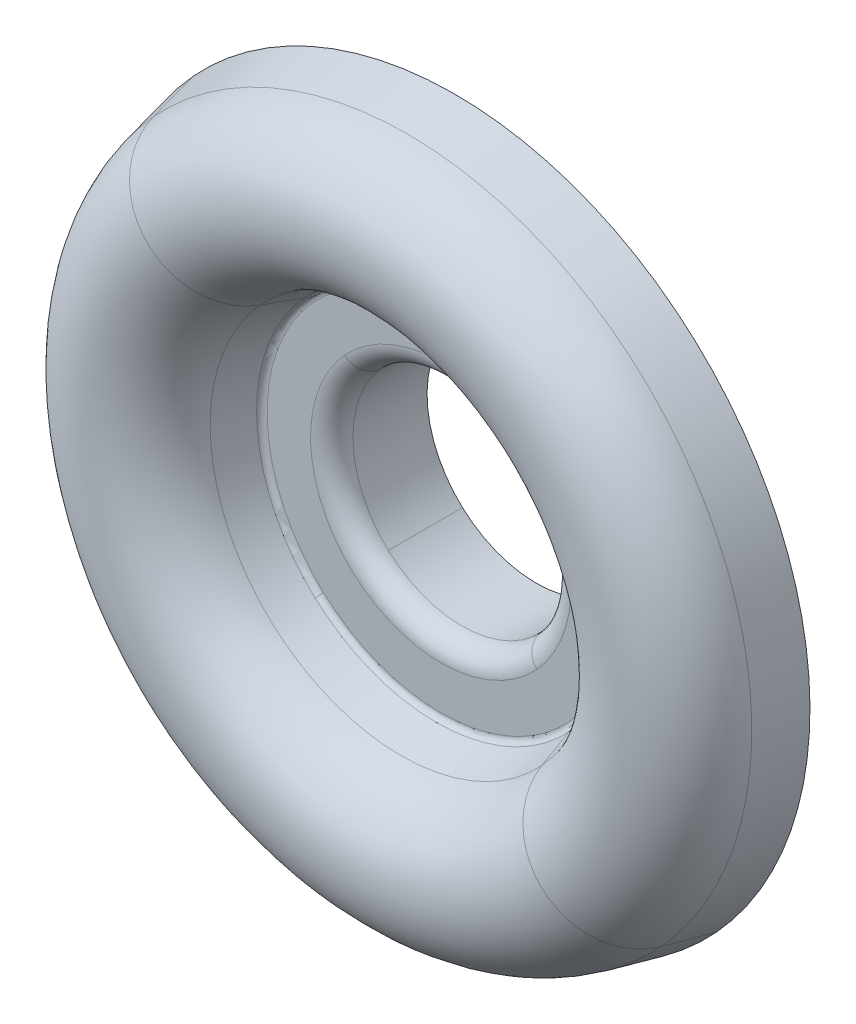
ISO-10303-21;
HEADER;
FILE_DESCRIPTION(('STEP AP214'),'2;1');
FILE_NAME('part.step','',(''),(''),'','','');
FILE_SCHEMA(('AUTOMOTIVE_DESIGN { 1 0 10303 214 1 1 1 1 }'));
ENDSEC;
DATA;
#1=APPLICATION_CONTEXT('core data for automotive mechanical design processes');
#2=APPLICATION_PROTOCOL_DEFINITION('international standard','automotive_design',2000,#1);
#3=PRODUCT_CONTEXT('',#1,'mechanical');
#4=PRODUCT('Part','Part','',(#3));
#5=PRODUCT_RELATED_PRODUCT_CATEGORY('part','',(#4));
#6=PRODUCT_DEFINITION_FORMATION('','',#4);
#7=PRODUCT_DEFINITION_CONTEXT('part definition',#1,'design');
#8=PRODUCT_DEFINITION('design','',#6,#7);
#9=PRODUCT_DEFINITION_SHAPE('','',#8);
#10=(LENGTH_UNIT() NAMED_UNIT(*) SI_UNIT(.MILLI.,.METRE.));
#11=(NAMED_UNIT(*) PLANE_ANGLE_UNIT() SI_UNIT($,.RADIAN.));
#12=(NAMED_UNIT(*) SI_UNIT($,.STERADIAN.) SOLID_ANGLE_UNIT());
#13=UNCERTAINTY_MEASURE_WITH_UNIT(LENGTH_MEASURE(1.E-05),#10,'distance_accuracy_value','');
#14=(GEOMETRIC_REPRESENTATION_CONTEXT(3) GLOBAL_UNCERTAINTY_ASSIGNED_CONTEXT((#13)) GLOBAL_UNIT_ASSIGNED_CONTEXT((#10,
#11,#12)) REPRESENTATION_CONTEXT('',''));
#15=CARTESIAN_POINT('',(0.,0.,0.));
#16=DIRECTION('',(0.,0.,1.));
#17=DIRECTION('',(1.,0.,0.));
#18=AXIS2_PLACEMENT_3D('',#15,#16,#17);
#19=CARTESIAN_POINT('',(5.15751240197929,0.152610441769653,10.4919115262798));
#20=DIRECTION('',(0.,0.,1.));
#21=DIRECTION('',(-0.675341182864473,-0.737505448608493,0.));
#22=AXIS2_PLACEMENT_3D('',#19,#20,#21);
#23=CYLINDRICAL_SURFACE('',#22,5.15);
#24=DIRECTION('',(0.,0.,1.));
#25=VECTOR('',#24,1.);
#26=CARTESIAN_POINT('',(8.63551949373132,3.95076350210339,10.4919115262798));
#27=LINE('',#26,#25);
#28=CARTESIAN_POINT('',(8.63551949373132,3.95076350210339,1.49521803507002));
#29=VERTEX_POINT('',#28);
#30=CARTESIAN_POINT('',(8.63551949373132,3.95076350210339,4.99521803507002));
#31=VERTEX_POINT('',#30);
#32=EDGE_CURVE('E296',#29,#31,#27,.T.);
#33=ORIENTED_EDGE('',*,*,#32,.F.);
#34=CARTESIAN_POINT('',(5.15751240197929,0.152610441769653,1.49521803507002));
#35=DIRECTION('',(0.,0.,-1.));
#36=DIRECTION('',(-0.675341182864473,-0.737505448608493,0.));
#37=AXIS2_PLACEMENT_3D('',#34,#35,#36);
#38=CIRCLE('',#37,5.15);
#39=CARTESIAN_POINT('',(1.67950531022725,-3.64554261856409,1.49521803507002));
#40=VERTEX_POINT('',#39);
#41=EDGE_CURVE('E11',#29,#40,#38,.T.);
#42=ORIENTED_EDGE('',*,*,#41,.T.);
#43=DIRECTION('',(0.,0.,1.));
#44=VECTOR('',#43,1.);
#45=CARTESIAN_POINT('',(1.67950531022725,-3.64554261856409,10.4919115262798));
#46=LINE('',#45,#44);
#47=CARTESIAN_POINT('',(1.67950531022725,-3.64554261856409,4.99521803507002));
#48=VERTEX_POINT('',#47);
#49=EDGE_CURVE('E166',#40,#48,#46,.T.);
#50=ORIENTED_EDGE('',*,*,#49,.T.);
#51=CARTESIAN_POINT('',(5.15751240197929,0.152610441769653,4.99521803507002));
#52=DIRECTION('',(0.,0.,-1.));
#53=DIRECTION('',(0.737505448608493,-0.675341182864473,0.));
#54=AXIS2_PLACEMENT_3D('',#51,#52,#53);
#55=CIRCLE('',#54,5.15);
#56=CARTESIAN_POINT('',(8.95566546231302,-3.32539664998238,4.99521803507002));
#57=VERTEX_POINT('',#56);
#58=EDGE_CURVE('E280',#57,#48,#55,.T.);
#59=ORIENTED_EDGE('',*,*,#58,.F.);
#60=CARTESIAN_POINT('',(5.15751240197929,0.152610441769653,4.99521803507002));
#61=DIRECTION('',(0.,0.,-1.));
#62=DIRECTION('',(0.737505448608493,-0.675341182864473,0.));
#63=AXIS2_PLACEMENT_3D('',#60,#61,#62);
#64=CIRCLE('',#63,5.15);
#65=EDGE_CURVE('E25',#31,#57,#64,.T.);
#66=ORIENTED_EDGE('',*,*,#65,.F.);
#67=EDGE_LOOP('',(#33,#42,#50,#59,#66));
#68=FACE_BOUND('',#67,.T.);
#69=ADVANCED_FACE('F17',(#68),#23,.F.);
#70=CARTESIAN_POINT('',(8.95566546231303,-3.32539664998238,1.49521803507002));
#71=DIRECTION('',(0.,0.,1.));
#72=DIRECTION('',(0.,-1.,0.));
#73=AXIS2_PLACEMENT_3D('',#70,#71,#72);
#74=PLANE('',#73);
#75=CARTESIAN_POINT('',(5.15751240197929,0.152610441769653,1.49521803507002));
#76=DIRECTION('',(0.,0.,-1.));
#77=DIRECTION('',(-0.675341182864473,-0.737505448608493,0.));
#78=AXIS2_PLACEMENT_3D('',#75,#76,#77);
#79=CIRCLE('',#78,5.15);
#80=EDGE_CURVE('E292',#40,#29,#79,.T.);
#81=ORIENTED_EDGE('',*,*,#80,.F.);
#82=ORIENTED_EDGE('',*,*,#41,.F.);
#83=EDGE_LOOP('',(#81,#82));
#84=FACE_BOUND('',#83,.T.);
#85=CARTESIAN_POINT('',(5.15751240197929,0.152610441769653,1.49521803499492));
#86=DIRECTION('',(0.,0.,1.));
#87=DIRECTION('',(-0.675341182864473,-0.737505448608493,0.));
#88=AXIS2_PLACEMENT_3D('',#85,#86,#87);
#89=CIRCLE('',#88,6.10000000006039);
#90=CARTESIAN_POINT('',(1.03793118646522,-4.3461727947867,1.49521803499492));
#91=VERTEX_POINT('',#90);
#92=CARTESIAN_POINT('',(9.27709361749335,4.651393678326,1.49521803499492));
#93=VERTEX_POINT('',#92);
#94=EDGE_CURVE('E212',#91,#93,#89,.T.);
#95=ORIENTED_EDGE('',*,*,#94,.F.);
#96=CARTESIAN_POINT('',(5.15751240197929,0.152610441769653,1.49521803499492));
#97=DIRECTION('',(0.,0.,1.));
#98=DIRECTION('',(-0.675341182864473,-0.737505448608493,0.));
#99=AXIS2_PLACEMENT_3D('',#96,#97,#98);
#100=CIRCLE('',#99,6.10000000006039);
#101=EDGE_CURVE('E323',#93,#91,#100,.T.);
#102=ORIENTED_EDGE('',*,*,#101,.F.);
#103=EDGE_LOOP('',(#95,#102));
#104=FACE_BOUND('',#103,.T.);
#105=ADVANCED_FACE('F342',(#84,#104),#74,.F.);
#106=CARTESIAN_POINT('',(5.15751240197929,0.152610441769653,4.99521803507001));
#107=DIRECTION('',(0.,0.,1.));
#108=DIRECTION('',(-0.737505448608493,0.675341182864473,0.));
#109=AXIS2_PLACEMENT_3D('',#106,#107,#108);
#110=TOROIDAL_SURFACE('',#109,6.15,1.);
#111=CARTESIAN_POINT('',(9.69317091092152,-4.00073783284685,4.99521803507002));
#112=DIRECTION('',(-0.675341182864473,-0.737505448608493,0.));
#113=DIRECTION('',(0.737505448608493,-0.675341182864473,0.));
#114=AXIS2_PLACEMENT_3D('',#111,#112,#113);
#115=CIRCLE('',#114,1.);
#116=CARTESIAN_POINT('',(9.69317091092152,-4.00073783284685,5.99521803507002));
#117=VERTEX_POINT('',#116);
#118=EDGE_CURVE('E276',#117,#57,#115,.T.);
#119=ORIENTED_EDGE('',*,*,#118,.F.);
#120=CARTESIAN_POINT('',(5.15751240197929,0.152610441769654,5.99521803507002));
#121=DIRECTION('',(0.,0.,1.));
#122=DIRECTION('',(-0.737505448608493,0.675341182864473,0.));
#123=AXIS2_PLACEMENT_3D('',#120,#121,#122);
#124=CIRCLE('',#123,6.15);
#125=CARTESIAN_POINT('',(0.621853893037051,4.30595871638616,5.99521803507001));
#126=VERTEX_POINT('',#125);
#127=EDGE_CURVE('E320',#117,#126,#124,.T.);
#128=ORIENTED_EDGE('',*,*,#127,.T.);
#129=CARTESIAN_POINT('',(0.621853893037052,4.30595871638616,4.99521803507001));
#130=DIRECTION('',(0.675341182864472,0.737505448608493,0.));
#131=DIRECTION('',(-0.737505448608493,0.675341182864473,0.));
#132=AXIS2_PLACEMENT_3D('',#129,#130,#131);
#133=CIRCLE('',#132,1.);
#134=CARTESIAN_POINT('',(1.35935934164554,3.63061753352169,4.99521803507002));
#135=VERTEX_POINT('',#134);
#136=EDGE_CURVE('E288',#126,#135,#133,.T.);
#137=ORIENTED_EDGE('',*,*,#136,.T.);
#138=CARTESIAN_POINT('',(5.15751240197929,0.152610441769653,4.99521803507002));
#139=DIRECTION('',(0.,0.,-1.));
#140=DIRECTION('',(0.737505448608493,-0.675341182864473,0.));
#141=AXIS2_PLACEMENT_3D('',#138,#139,#140);
#142=CIRCLE('',#141,5.15);
#143=EDGE_CURVE('E300',#135,#31,#142,.T.);
#144=ORIENTED_EDGE('',*,*,#143,.T.);
#145=ORIENTED_EDGE('',*,*,#65,.T.);
#146=EDGE_LOOP('',(#119,#128,#137,#144,#145));
#147=FACE_BOUND('',#146,.T.);
#148=ADVANCED_FACE('F330',(#147),#110,.T.);
#149=CARTESIAN_POINT('',(5.15751240197929,0.152610441769653,4.9954828752401));
#150=DIRECTION('',(0.,0.,1.));
#151=DIRECTION('',(-0.675341182864473,-0.737505448608493,0.));
#152=AXIS2_PLACEMENT_3D('',#149,#150,#151);
#153=CONICAL_SURFACE('',#152,11.2565941322487,0.974444845103528);
#154=DIRECTION('',(0.558770693541171,0.610204799389614,0.561627469806632));
#155=VECTOR('',#154,1.);
#156=CARTESIAN_POINT('',(12.7595539982774,8.45440994707744,4.9954828752401));
#157=LINE('',#156,#155);
#158=CARTESIAN_POINT('',(12.7595539982774,8.45440994707744,4.9954828752401));
#159=VERTEX_POINT('',#158);
#160=EDGE_CURVE('E215',#93,#159,#157,.T.);
#161=ORIENTED_EDGE('',*,*,#160,.F.);
#162=ORIENTED_EDGE('',*,*,#101,.T.);
#163=DIRECTION('',(-0.558770693541171,-0.610204799389614,0.561627469806632));
#164=VECTOR('',#163,1.);
#165=CARTESIAN_POINT('',(-2.44452919431881,-8.14918906353813,4.9954828752401));
#166=LINE('',#165,#164);
#167=CARTESIAN_POINT('',(-2.44452919431881,-8.14918906353813,4.9954828752401));
#168=VERTEX_POINT('',#167);
#169=EDGE_CURVE('E268',#91,#168,#166,.T.);
#170=ORIENTED_EDGE('',*,*,#169,.T.);
#171=CARTESIAN_POINT('',(5.15751240197929,0.152610441769653,4.9954828752401));
#172=DIRECTION('',(0.,0.,-1.));
#173=DIRECTION('',(-0.675341182864473,-0.737505448608493,0.));
#174=AXIS2_PLACEMENT_3D('',#171,#172,#173);
#175=CIRCLE('',#174,11.2565941322487);
#176=EDGE_CURVE('E314',#168,#159,#175,.T.);
#177=ORIENTED_EDGE('',*,*,#176,.T.);
#178=EDGE_LOOP('',(#161,#162,#170,#177));
#179=FACE_BOUND('',#178,.T.);
#180=ADVANCED_FACE('F353',(#179),#153,.T.);
#181=CARTESIAN_POINT('',(11.2050570805689,-5.38518725771902,5.99521803507002));
#182=DIRECTION('',(0.,0.,-1.));
#183=DIRECTION('',(-1.,0.,0.));
#184=AXIS2_PLACEMENT_3D('',#181,#182,#183);
#185=PLANE('',#184);
#186=CARTESIAN_POINT('',(5.15751240197929,0.152610441769654,5.99521803507002));
#187=DIRECTION('',(0.,0.,1.));
#188=DIRECTION('',(-0.737505448608493,0.675341182864473,0.));
#189=AXIS2_PLACEMENT_3D('',#186,#187,#188);
#190=CIRCLE('',#189,6.15);
#191=EDGE_CURVE('E272',#126,#117,#190,.T.);
#192=ORIENTED_EDGE('',*,*,#191,.F.);
#193=ORIENTED_EDGE('',*,*,#127,.F.);
#194=EDGE_LOOP('',(#192,#193));
#195=FACE_BOUND('',#194,.T.);
#196=CARTESIAN_POINT('',(-0.380285297509393,-5.89493423682,5.99521803507002));
#197=CARTESIAN_POINT('',(-0.0922213743543307,-6.15871727865539,5.99521803507002));
#198=CARTESIAN_POINT('',(0.363179620260049,-6.52013975612108,5.99521803507002));
#199=CARTESIAN_POINT('',(0.93526472293661,-6.88185816391147,5.99521803507002));
#200=CARTESIAN_POINT('',(1.23150325984817,-7.04773208049343,5.99521803507002));
#201=CARTESIAN_POINT('',(1.38217152469727,-7.1269227169561,5.99521803507002));
#202=CARTESIAN_POINT('',(1.45814290622015,-7.16558145473036,5.99521803507002));
#203=CARTESIAN_POINT('',(1.49628790925618,-7.18467667850323,5.99521803507002));
#204=CARTESIAN_POINT('',(1.51266990604474,-7.19281017188139,5.99521803507002));
#205=CARTESIAN_POINT('',(1.52359882353591,-7.19822135103283,5.99521803507001));
#206=CARTESIAN_POINT('',(1.52801183913365,-7.20040176644097,5.99521803507002));
#207=CARTESIAN_POINT('',(1.74341212340666,-7.30646505648578,5.99521803507002));
#208=CARTESIAN_POINT('',(2.06197003369478,-7.44690754042669,5.99521803507002));
#209=CARTESIAN_POINT('',(2.44280563934014,-7.5865521681706,5.99521803507001));
#210=CARTESIAN_POINT('',(2.63551961974013,-7.6503232478291,5.99521803507002));
#211=CARTESIAN_POINT('',(2.73245065433446,-7.68069597910498,5.99521803507002));
#212=CARTESIAN_POINT('',(2.77411553581653,-7.69338869067607,5.99521803507002));
#213=CARTESIAN_POINT('',(2.80191945891858,-7.70177845988759,5.99521803507002));
#214=CARTESIAN_POINT('',(2.81415347557782,-7.70543959516857,5.99521803507002));
#215=CARTESIAN_POINT('',(3.0795389390133,-7.78398939017279,5.99521803507002));
#216=CARTESIAN_POINT('',(3.45762443742333,-7.87669177297467,5.99521803507002));
#217=CARTESIAN_POINT('',(3.90471560400414,-7.95300952339128,5.99521803507002));
#218=CARTESIAN_POINT('',(4.12975904190349,-7.98320964121984,5.99521803507002));
#219=CARTESIAN_POINT('',(4.24265522450539,-7.99632001078921,5.99521803507002));
#220=CARTESIAN_POINT('',(4.29111954497455,-8.00151237860216,5.99521803507002));
#221=CARTESIAN_POINT('',(4.32344692355648,-8.00487921003246,5.99521803507002));
#222=CARTESIAN_POINT('',(4.33789392939384,-8.00634583638863,5.99521803507002));
#223=CARTESIAN_POINT('',(4.6423149719147,-8.03623327130151,5.99521803507002));
#224=CARTESIAN_POINT('',(5.07179903779497,-8.05583862249786,5.99521803507002));
#225=CARTESIAN_POINT('',(5.5723618503844,-8.0391813517417,5.99521803507002));
#226=CARTESIAN_POINT('',(5.82251777394472,-8.02097017124231,5.99521803507002));
#227=CARTESIAN_POINT('',(5.94756436504129,-8.00939394471229,5.99521803507002));
#228=CARTESIAN_POINT('',(6.00114903893619,-8.00390328271078,5.99521803507002));
#229=CARTESIAN_POINT('',(6.03687066102405,-8.00012519202975,5.99521803507002));
#230=CARTESIAN_POINT('',(6.05317768416777,-7.9983518235966,5.99521803507002));
#231=CARTESIAN_POINT('',(6.38318777324513,-7.96127148704247,5.99521803507002));
#232=CARTESIAN_POINT('',(6.84300716477513,-7.88302393143348,5.99521803507002));
#233=CARTESIAN_POINT('',(7.36882801313475,-7.74641213749201,5.99521803507002));
#234=CARTESIAN_POINT('',(7.62907966020821,-7.66677549575518,5.99521803507002));
#235=CARTESIAN_POINT('',(7.75854078946835,-7.62412448869526,5.99521803507002));
#236=CARTESIAN_POINT('',(7.81388169609201,-7.60523848148567,5.99521803507002));
#237=CARTESIAN_POINT('',(7.85074398173269,-7.59251292019397,5.99521803507002));
#238=CARTESIAN_POINT('',(7.86802337357801,-7.58648383975328,5.99521803507002));
#239=CARTESIAN_POINT('',(8.20012543933509,-7.46920397491077,5.99521803507002));
#240=CARTESIAN_POINT('',(8.65558415075386,-7.27689754303785,5.99521803507002));
#241=CARTESIAN_POINT('',(9.16351793581564,-7.0057540377253,5.99521803507002));
#242=CARTESIAN_POINT('',(9.41162615044816,-6.85848578470382,5.99521803507002));
#243=CARTESIAN_POINT('',(9.51670281145531,-6.79286442618779,5.99521803507002));
#244=CARTESIAN_POINT('',(9.58647493413158,-6.7485598776359,5.99521803507002));
#245=CARTESIAN_POINT('',(9.6201031506096,-6.72686298098968,5.99521803507002));
#246=CARTESIAN_POINT('',(10.2274354471033,-6.32833000529265,5.99521803507002));
#247=CARTESIAN_POINT('',(10.743368490469,-5.8894395183394,5.99521803507002));
#248=CARTESIAN_POINT('',(11.4359013756189,-5.13306112740884,5.99521803507002));
#249=CARTESIAN_POINT('',(11.7561685850499,-4.73658900995233,5.99521803507002));
#250=CARTESIAN_POINT('',(12.0843150047175,-4.24204309276841,5.99521803507002));
#251=CARTESIAN_POINT('',(12.2370135500509,-3.9867713558053,5.99521803507002));
#252=CARTESIAN_POINT('',(12.3000183556579,-3.87565515888443,5.99521803507002));
#253=CARTESIAN_POINT('',(12.3414799087054,-3.80119680006237,5.99521803507002));
#254=CARTESIAN_POINT('',(12.3625314198946,-3.76267516369629,5.99521803507002));
#255=CARTESIAN_POINT('',(12.5389095122982,-3.43410258978234,5.99521803507002));
#256=CARTESIAN_POINT('',(12.7461792443751,-2.98525560316384,5.99521803507002));
#257=CARTESIAN_POINT('',(12.9391670806579,-2.44278789799251,5.99521803507002));
#258=CARTESIAN_POINT('',(13.0234542860142,-2.16685082354438,5.99521803507002));
#259=CARTESIAN_POINT('',(13.0625462104961,-2.02770648085472,5.99521803507002));
#260=CARTESIAN_POINT('',(13.0786459613749,-1.96782123281651,5.99521803507002));
#261=CARTESIAN_POINT('',(13.089233810618,-1.92784174338792,5.99521803507002));
#262=CARTESIAN_POINT('',(13.0947441074525,-1.90669868071594,5.99521803507002));
#263=CARTESIAN_POINT('',(13.1773568891613,-1.58505166207388,5.99521803507002));
#264=CARTESIAN_POINT('',(13.2676179983396,-1.12743881920578,5.99521803507002));
#265=CARTESIAN_POINT('',(13.3267774002017,-0.587392034348306,5.99521803507002));
#266=CARTESIAN_POINT('',(13.3448207947546,-0.315827358208397,5.99521803507002));
#267=CARTESIAN_POINT('',(13.3509584154365,-0.179659699210654,5.99521803507002));
#268=CARTESIAN_POINT('',(13.352970807887,-0.121219562298518,5.99521803507002));
#269=CARTESIAN_POINT('',(13.3541750658734,-0.0822411224081536,5.99521803507002));
#270=CARTESIAN_POINT('',(13.3547447294604,-0.0612232654128072,5.99521803507002));
#271=CARTESIAN_POINT('',(13.3620307412422,0.244574533500518,5.99521803507002));
#272=CARTESIAN_POINT('',(13.3498118146743,0.674332143889511,5.99521803507002));
#273=CARTESIAN_POINT('',(13.2961725438606,1.1722913964833,5.99521803507002));
#274=CARTESIAN_POINT('',(13.2595069443327,1.42041486623184,5.99521803507002));
#275=CARTESIAN_POINT('',(13.2387126535384,1.54426256196903,5.99521803507002));
#276=CARTESIAN_POINT('',(13.229273352263,1.59729428032702,5.99521803507002));
#277=CARTESIAN_POINT('',(13.2228632708874,1.63263856689249,5.99521803507002));
#278=CARTESIAN_POINT('',(13.2192869624532,1.6519677985059,5.99521803507002));
#279=CARTESIAN_POINT('',(13.1681238690565,1.9239638280243,5.99521803507002));
#280=CARTESIAN_POINT('',(13.0781435425977,2.30270636247218,5.99521803507002));
#281=CARTESIAN_POINT('',(12.9421038603869,2.73538189737027,5.99521803507002));
#282=CARTESIAN_POINT('',(12.8663183606125,2.94942197599653,5.99521803507002));
#283=CARTESIAN_POINT('',(12.8264841960582,3.05586759310399,5.99521803507002));
#284=CARTESIAN_POINT('',(12.8089963938204,3.10136405282024,5.99521803507002));
#285=CARTESIAN_POINT('',(12.7972454106778,3.13166767252604,5.99521803507002));
#286=CARTESIAN_POINT('',(12.7906967975232,3.14839454196598,5.99521803507002));
#287=CARTESIAN_POINT('',(12.6998990756316,3.37850178380742,5.99521803507002));
#288=CARTESIAN_POINT('',(12.5585259346154,3.69664788951783,5.99521803507002));
#289=CARTESIAN_POINT('',(12.3705113901483,4.05607378662377,5.99521803507002));
#290=CARTESIAN_POINT('',(12.2707343145944,4.23285059528768,5.99521803507002));
#291=CARTESIAN_POINT('',(12.2194033259873,4.32050496464737,5.99521803507002));
#292=CARTESIAN_POINT('',(12.1933772189763,4.36414864058415,5.99521803507002));
#293=CARTESIAN_POINT('',(12.1821458989628,4.3828137498264,5.99521803507002));
#294=CARTESIAN_POINT('',(12.1746411802534,4.39524841747633,5.99521803507002));
#295=CARTESIAN_POINT('',(12.1702780085867,4.40245327705017,5.99521803507002));
#296=CARTESIAN_POINT('',(11.7616956515698,5.07540761687473,5.99521803507002));
#297=CARTESIAN_POINT('',(11.2710954508946,5.67290266454155,5.99521803507002));
#298=CARTESIAN_POINT('',(10.695310101468,6.2001551203593,5.99521803507002));
#299=(BOUNDED_CURVE() B_SPLINE_CURVE(3,(#196,#197,#198,#199,#200,#201,#202,#203,#204,#205,#206,
#207,#208,#209,#210,#211,#212,#213,#214,#215,#216,#217,#218,#219,#220,#221,#222,#223,#224,#225,
#226,#227,#228,#229,#230,#231,#232,#233,#234,#235,#236,#237,#238,#239,#240,#241,#242,#243,#244,
#245,#246,#247,#248,#249,#250,#251,#252,#253,#254,#255,#256,#257,#258,#259,#260,#261,#262,#263,
#264,#265,#266,#267,#268,#269,#270,#271,#272,#273,#274,#275,#276,#277,#278,#279,#280,#281,#282,
#283,#284,#285,#286,#287,#288,#289,#290,#291,#292,#293,#294,#295,#296,#297,#298),.UNSPECIFIED.,
.F.,.F.) B_SPLINE_CURVE_WITH_KNOTS((4,1,1,1,1,1,1,2,2,1,1,1,1,2,2,1,1,1,1,2,2,1,1,1,1,2,2,1,1,1,
1,2,2,1,1,1,2,2,2,1,1,1,2,2,1,1,1,1,2,2,1,1,1,1,2,2,1,1,1,1,2,2,1,1,1,1,2,2,1,1,1,1,1,2,2,4),
(0.,0.0625000000000021,0.0937500000000032,0.109375000000004,0.117187500000004,0.121093750000004,
0.123046875000004,0.124023437500004,0.125000000000004,0.156250000000005,0.171875000000006,
0.179687500000006,0.183593750000006,0.185546875000006,0.187500000000006,0.218750000000006,
0.234375000000006,0.242187500000006,0.246093750000006,0.248046875000006,0.250000000000006,
0.281250000000007,0.296875000000007,0.304687500000007,0.308593750000007,0.310546875000007,
0.312500000000007,0.343750000000007,0.359375000000008,0.367187500000008,0.371093750000008,
0.373046875000008,0.375000000000008,0.406250000000007,0.421875000000006,0.429687500000006,
0.433593750000006,0.437500000000005,0.5,0.53125,0.546875,0.5546875,0.558593750000003,0.5625,
0.59375,0.609375,0.6171875,0.621093750000003,0.623046875000003,0.625,0.65625,0.671875,0.6796875,
0.683593750000003,0.685546875000003,0.6875,0.71875,0.734375,0.7421875,0.746093750000003,
0.748046875000003,0.75,0.78125,0.796875,0.8046875,0.808593750000003,0.810546875000004,0.8125,
0.84375,0.859375,0.8671875,0.871093750000003,0.873046875000003,0.874023437500003,0.875,1.),
.UNSPECIFIED.) CURVE() GEOMETRIC_REPRESENTATION_ITEM() RATIONAL_B_SPLINE_CURVE((1.,1.,1.,1.,1.,
1.,1.,1.,1.,1.,1.,1.,1.,1.,1.,1.,1.,1.,1.,1.,1.,1.,1.,1.,1.,1.,1.,1.,1.,1.,1.,1.,1.,1.,1.,1.,1.,
1.,1.,1.,1.,1.,1.,1.,1.,1.,1.,1.,1.,1.,1.,1.,1.,1.,1.,1.,1.,1.,1.,1.,1.,1.,1.,1.,1.,1.,1.,1.,1.,
1.,1.,1.,1.,1.,1.,1.,1.,1.,1.,1.,1.,1.,1.,1.,1.,1.,1.,1.,1.,1.,1.,1.,1.,1.,1.,1.,1.,1.,1.,1.,1.,
1.,1.)) REPRESENTATION_ITEM(''));
#300=CARTESIAN_POINT('',(-0.380285297509393,-5.89493423682,5.99521803507002));
#301=VERTEX_POINT('',#300);
#302=CARTESIAN_POINT('',(10.695310101468,6.2001551203593,5.99521803507002));
#303=VERTEX_POINT('',#302);
#304=EDGE_CURVE('E309',#301,#303,#299,.T.);
#305=ORIENTED_EDGE('',*,*,#304,.T.);
#306=CARTESIAN_POINT('',(5.15751240197929,0.152610441769654,5.99521803507002));
#307=DIRECTION('',(0.,0.,1.));
#308=DIRECTION('',(-0.675341182864473,-0.737505448608493,0.));
#309=AXIS2_PLACEMENT_3D('',#306,#307,#308);
#310=CIRCLE('',#309,8.2);
#311=EDGE_CURVE('E247',#303,#301,#310,.T.);
#312=ORIENTED_EDGE('',*,*,#311,.T.);
#313=EDGE_LOOP('',(#305,#312));
#314=FACE_BOUND('',#313,.T.);
#315=ADVANCED_FACE('F338',(#195,#314),#185,.F.);
#316=CARTESIAN_POINT('',(16.4314198622499,-10.1710204060961,4.99548287531199));
#317=DIRECTION('',(0.,0.,1.));
#318=DIRECTION('',(0.,-1.,0.));
#319=AXIS2_PLACEMENT_3D('',#316,#317,#318);
#320=PLANE('',#319);
#321=ORIENTED_EDGE('',*,*,#176,.F.);
#322=CARTESIAN_POINT('',(5.15751240197929,0.152610441769653,4.9954828752401));
#323=DIRECTION('',(0.,0.,-1.));
#324=DIRECTION('',(-0.675341182864473,-0.737505448608493,0.));
#325=AXIS2_PLACEMENT_3D('',#322,#323,#324);
#326=CIRCLE('',#325,11.2565941322487);
#327=EDGE_CURVE('E226',#159,#168,#326,.T.);
#328=ORIENTED_EDGE('',*,*,#327,.F.);
#329=EDGE_LOOP('',(#321,#328));
#330=FACE_BOUND('',#329,.T.);
#331=CARTESIAN_POINT('',(5.15751240197929,0.152610441769653,4.99548287531199));
#332=DIRECTION('',(0.,0.,1.));
#333=DIRECTION('',(-0.675341182864473,-0.737505448608493,0.));
#334=AXIS2_PLACEMENT_3D('',#331,#332,#333);
#335=CIRCLE('',#334,15.2865412473113);
#336=CARTESIAN_POINT('',(-5.16611844588652,-11.121297018501,4.99548287531198));
#337=VERTEX_POINT('',#336);
#338=CARTESIAN_POINT('',(15.4811432498451,11.4265179020403,4.99548287531199));
#339=VERTEX_POINT('',#338);
#340=EDGE_CURVE('E200',#337,#339,#335,.T.);
#341=ORIENTED_EDGE('',*,*,#340,.F.);
#342=CARTESIAN_POINT('',(5.15751240197929,0.152610441769653,4.99548287531199));
#343=DIRECTION('',(0.,0.,1.));
#344=DIRECTION('',(-0.675341182864473,-0.737505448608493,0.));
#345=AXIS2_PLACEMENT_3D('',#342,#343,#344);
#346=CIRCLE('',#345,15.2865412473113);
#347=EDGE_CURVE('E251',#339,#337,#346,.T.);
#348=ORIENTED_EDGE('',*,*,#347,.F.);
#349=EDGE_LOOP('',(#341,#348));
#350=FACE_BOUND('',#349,.T.);
#351=ADVANCED_FACE('F355',(#330,#350),#320,.F.);
#352=CARTESIAN_POINT('',(5.15751240197929,0.152610441769654,6.29521803507001));
#353=DIRECTION('',(0.,0.,1.));
#354=DIRECTION('',(-0.675341182864473,-0.737505448608493,0.));
#355=AXIS2_PLACEMENT_3D('',#352,#353,#354);
#356=TOROIDAL_SURFACE('',#355,8.2,0.299999999999993);
#357=CARTESIAN_POINT('',(10.695310101468,6.20015512035931,6.29521803507001));
#358=DIRECTION('',(0.737505448608493,-0.675341182864473,0.));
#359=DIRECTION('',(0.675341182864473,0.737505448608493,0.));
#360=AXIS2_PLACEMENT_3D('',#357,#358,#359);
#361=CIRCLE('',#360,0.299999999999994);
#362=CARTESIAN_POINT('',(10.8885662131305,6.41120020237769,6.20515112293842));
#363=VERTEX_POINT('',#362);
#364=EDGE_CURVE('E255',#303,#363,#361,.T.);
#365=ORIENTED_EDGE('',*,*,#364,.F.);
#366=ORIENTED_EDGE('',*,*,#304,.F.);
#367=CARTESIAN_POINT('',(-0.380285297509397,-5.89493423682,6.29521803507001));
#368=DIRECTION('',(-0.737505448608493,0.675341182864473,0.));
#369=DIRECTION('',(-0.675341182864473,-0.737505448608493,0.));
#370=AXIS2_PLACEMENT_3D('',#367,#368,#369);
#371=CIRCLE('',#370,0.299999999999993);
#372=CARTESIAN_POINT('',(-0.573541409171952,-6.10597931883839,6.20515112293842));
#373=VERTEX_POINT('',#372);
#374=EDGE_CURVE('E216',#301,#373,#371,.T.);
#375=ORIENTED_EDGE('',*,*,#374,.T.);
#376=CARTESIAN_POINT('',(5.15751240197929,0.152610441769653,6.20515112293842));
#377=DIRECTION('',(0.,0.,1.));
#378=DIRECTION('',(-0.675341182864473,-0.737505448608493,0.));
#379=AXIS2_PLACEMENT_3D('',#376,#377,#378);
#380=CIRCLE('',#379,8.48616070893658);
#381=CARTESIAN_POINT('',(11.4161021625873,-5.57844336938159,6.20515112293842));
#382=VERTEX_POINT('',#381);
#383=EDGE_CURVE('E248',#373,#382,#380,.T.);
#384=ORIENTED_EDGE('',*,*,#383,.T.);
#385=CARTESIAN_POINT('',(5.15751240197929,0.152610441769653,6.20515112293842));
#386=DIRECTION('',(0.,0.,1.));
#387=DIRECTION('',(-0.675341182864473,-0.737505448608493,0.));
#388=AXIS2_PLACEMENT_3D('',#385,#386,#387);
#389=CIRCLE('',#388,8.48616070893658);
#390=EDGE_CURVE('E204',#382,#363,#389,.T.);
#391=ORIENTED_EDGE('',*,*,#390,.T.);
#392=EDGE_LOOP('',(#365,#366,#375,#384,#391));
#393=FACE_BOUND('',#392,.T.);
#394=ADVANCED_FACE('F358',(#393),#356,.F.);
#395=CARTESIAN_POINT('',(5.15751240197929,0.152610441769653,5.32419277154373));
#396=DIRECTION('',(0.,0.,1.));
#397=DIRECTION('',(-0.675341182864473,-0.737505448608493,0.));
#398=AXIS2_PLACEMENT_3D('',#395,#396,#397);
#399=CONICAL_SURFACE('',#398,16.7500814087416,1.34986343898649);
#400=DIRECTION('',(0.65892596252665,0.719579228874781,0.219139930821161));
#401=VECTOR('',#400,1.);
#402=CARTESIAN_POINT('',(16.4695321936351,12.5058867453524,5.32419277154373));
#403=LINE('',#402,#401);
#404=CARTESIAN_POINT('',(16.4695321936351,12.5058867453524,5.32419277154373));
#405=VERTEX_POINT('',#404);
#406=EDGE_CURVE('E227',#339,#405,#403,.T.);
#407=ORIENTED_EDGE('',*,*,#406,.F.);
#408=ORIENTED_EDGE('',*,*,#347,.T.);
#409=DIRECTION('',(-0.65892596252665,-0.719579228874782,0.219139930821161));
#410=VECTOR('',#409,1.);
#411=CARTESIAN_POINT('',(-6.1545073896765,-12.2006658618131,5.32419277154373));
#412=LINE('',#411,#410);
#413=CARTESIAN_POINT('',(-6.15450738967649,-12.2006658618131,5.32419277154372));
#414=VERTEX_POINT('',#413);
#415=EDGE_CURVE('E244',#337,#414,#412,.T.);
#416=ORIENTED_EDGE('',*,*,#415,.T.);
#417=CARTESIAN_POINT('',(5.15751240197929,0.152610441769653,5.32419277154372));
#418=DIRECTION('',(0.,0.,1.));
#419=DIRECTION('',(0.737505448608493,-0.675341182864473,0.));
#420=AXIS2_PLACEMENT_3D('',#417,#418,#419);
#421=CIRCLE('',#420,16.7500814087416);
#422=CARTESIAN_POINT('',(-7.1957639016035,11.4646302334254,5.32419277154372));
#423=VERTEX_POINT('',#422);
#424=EDGE_CURVE('E177',#423,#414,#421,.T.);
#425=ORIENTED_EDGE('',*,*,#424,.F.);
#426=CARTESIAN_POINT('',(5.15751240197929,0.152610441769653,5.32419277154372));
#427=DIRECTION('',(0.,0.,1.));
#428=DIRECTION('',(0.737505448608493,-0.675341182864473,0.));
#429=AXIS2_PLACEMENT_3D('',#426,#427,#428);
#430=CIRCLE('',#429,16.7500814087416);
#431=EDGE_CURVE('E165',#405,#423,#430,.T.);
#432=ORIENTED_EDGE('',*,*,#431,.F.);
#433=EDGE_LOOP('',(#407,#408,#416,#425,#432));
#434=FACE_BOUND('',#433,.T.);
#435=ADVANCED_FACE('F367',(#434),#399,.T.);
#436=CARTESIAN_POINT('',(5.15751240197929,0.152610441769653,7.8710544367148));
#437=DIRECTION('',(0.,0.,1.));
#438=DIRECTION('',(-0.737505448608493,0.675341182864473,0.));
#439=AXIS2_PLACEMENT_3D('',#436,#437,#438);
#440=CONICAL_SURFACE('',#439,9.01049113829285,0.304926472523929);
#441=DIRECTION('',(0.221416128121282,-0.202752983252978,0.953869029788575));
#442=VECTOR('',#441,1.);
#443=CARTESIAN_POINT('',(11.8027987111088,-5.93254530175489,7.8710544367148));
#444=LINE('',#443,#442);
#445=CARTESIAN_POINT('',(11.8027987111088,-5.93254530175489,7.87105443671479));
#446=VERTEX_POINT('',#445);
#447=EDGE_CURVE('E208',#382,#446,#444,.T.);
#448=ORIENTED_EDGE('',*,*,#447,.F.);
#449=ORIENTED_EDGE('',*,*,#383,.F.);
#450=CARTESIAN_POINT('',(5.15751240197929,0.152610441769653,6.20515112293842));
#451=DIRECTION('',(0.,0.,1.));
#452=DIRECTION('',(-0.675341182864473,-0.737505448608493,0.));
#453=AXIS2_PLACEMENT_3D('',#450,#451,#452);
#454=CIRCLE('',#453,8.48616070893658);
#455=CARTESIAN_POINT('',(-1.10107735862875,5.88366425292089,6.20515112293842));
#456=VERTEX_POINT('',#455);
#457=EDGE_CURVE('E258',#456,#373,#454,.T.);
#458=ORIENTED_EDGE('',*,*,#457,.F.);
#459=DIRECTION('',(-0.221416128121282,0.202752983252978,0.953869029788575));
#460=VECTOR('',#459,1.);
#461=CARTESIAN_POINT('',(-1.48777390715024,6.2377661852942,7.8710544367148));
#462=LINE('',#461,#460);
#463=CARTESIAN_POINT('',(-1.48777390715024,6.2377661852942,7.87105443671479));
#464=VERTEX_POINT('',#463);
#465=EDGE_CURVE('E201',#456,#464,#462,.T.);
#466=ORIENTED_EDGE('',*,*,#465,.T.);
#467=CARTESIAN_POINT('',(5.15751240197929,0.152610441769654,7.87105443671479));
#468=DIRECTION('',(0.,0.,-1.));
#469=DIRECTION('',(0.737505448608493,-0.675341182864473,0.));
#470=AXIS2_PLACEMENT_3D('',#467,#468,#469);
#471=CIRCLE('',#470,9.01049113829285);
#472=EDGE_CURVE('E183',#446,#464,#471,.T.);
#473=ORIENTED_EDGE('',*,*,#472,.F.);
#474=EDGE_LOOP('',(#448,#449,#458,#466,#473));
#475=FACE_BOUND('',#474,.T.);
#476=ADVANCED_FACE('F369',(#475),#440,.F.);
#477=CARTESIAN_POINT('',(5.15751240197929,0.152610441769653,5.32419277154373));
#478=DIRECTION('',(0.,0.,-1.));
#479=DIRECTION('',(0.737505448608493,-0.675341182864473,0.));
#480=AXIS2_PLACEMENT_3D('',#477,#478,#479);
#481=CONICAL_SURFACE('',#480,16.7500814087416,0.220932887808385);
#482=DIRECTION('',(-0.161616892988278,0.147994220093586,-0.975693440953513));
#483=VECTOR('',#482,1.);
#484=CARTESIAN_POINT('',(-7.1957639016035,11.4646302334254,5.32419277154373));
#485=LINE('',#484,#483);
#486=CARTESIAN_POINT('',(-6.82425954066058,11.1244399405512,7.56699277564927));
#487=VERTEX_POINT('',#486);
#488=EDGE_CURVE('E169',#487,#423,#485,.T.);
#489=ORIENTED_EDGE('',*,*,#488,.F.);
#490=CARTESIAN_POINT('',(5.15751240197929,0.152610441769654,7.56699277564927));
#491=DIRECTION('',(0.,0.,1.));
#492=DIRECTION('',(-0.737505448608493,0.675341182864473,0.));
#493=AXIS2_PLACEMENT_3D('',#490,#491,#492);
#494=CIRCLE('',#493,16.2463504035757);
#495=CARTESIAN_POINT('',(17.1392843446191,-10.8192190570118,7.56699277564928));
#496=VERTEX_POINT('',#495);
#497=EDGE_CURVE('E152',#496,#487,#494,.T.);
#498=ORIENTED_EDGE('',*,*,#497,.F.);
#499=DIRECTION('',(0.161616892988278,-0.147994220093586,-0.975693440953513));
#500=VECTOR('',#499,1.);
#501=CARTESIAN_POINT('',(17.510788705562,-11.1594093498861,5.32419277154373));
#502=LINE('',#501,#500);
#503=CARTESIAN_POINT('',(17.510788705562,-11.1594093498861,5.32419277154372));
#504=VERTEX_POINT('',#503);
#505=EDGE_CURVE('E188',#496,#504,#502,.T.);
#506=ORIENTED_EDGE('',*,*,#505,.T.);
#507=CARTESIAN_POINT('',(5.15751240197929,0.152610441769653,5.32419277154372));
#508=DIRECTION('',(0.,0.,1.));
#509=DIRECTION('',(0.737505448608493,-0.675341182864473,0.));
#510=AXIS2_PLACEMENT_3D('',#507,#508,#509);
#511=CIRCLE('',#510,16.7500814087416);
#512=EDGE_CURVE('E231',#504,#405,#511,.T.);
#513=ORIENTED_EDGE('',*,*,#512,.T.);
#514=ORIENTED_EDGE('',*,*,#431,.T.);
#515=EDGE_LOOP('',(#489,#498,#506,#513,#514));
#516=FACE_BOUND('',#515,.T.);
#517=ADVANCED_FACE('F170',(#516),#481,.T.);
#518=CARTESIAN_POINT('',(5.15751240197929,0.152610441769654,6.74521803507002));
#519=DIRECTION('',(0.,0.,1.));
#520=DIRECTION('',(-0.737505448608493,0.675341182864473,0.));
#521=AXIS2_PLACEMENT_3D('',#518,#519,#520);
#522=TOROIDAL_SURFACE('',#521,12.5875,3.75);
#523=CARTESIAN_POINT('',(14.4408622363387,-8.3482466975369,6.74521803507002));
#524=DIRECTION('',(-0.675341182864473,-0.737505448608493,0.));
#525=DIRECTION('',(0.737505448608493,-0.675341182864473,0.));
#526=AXIS2_PLACEMENT_3D('',#523,#524,#525);
#527=CIRCLE('',#526,3.75);
#528=EDGE_CURVE('E159',#496,#446,#527,.T.);
#529=ORIENTED_EDGE('',*,*,#528,.F.);
#530=ORIENTED_EDGE('',*,*,#497,.T.);
#531=CARTESIAN_POINT('',(-4.12583743238014,8.65346758107621,6.74521803507002));
#532=DIRECTION('',(0.675341182864473,0.737505448608493,0.));
#533=DIRECTION('',(-0.737505448608493,0.675341182864473,0.));
#534=AXIS2_PLACEMENT_3D('',#531,#532,#533);
#535=CIRCLE('',#534,3.75);
#536=EDGE_CURVE('E156',#487,#464,#535,.T.);
#537=ORIENTED_EDGE('',*,*,#536,.T.);
#538=CARTESIAN_POINT('',(5.15751240197929,0.152610441769654,7.87105443671479));
#539=DIRECTION('',(0.,0.,-1.));
#540=DIRECTION('',(0.737505448608493,-0.675341182864473,0.));
#541=AXIS2_PLACEMENT_3D('',#538,#539,#540);
#542=CIRCLE('',#541,9.01049113829285);
#543=EDGE_CURVE('E209',#464,#446,#542,.T.);
#544=ORIENTED_EDGE('',*,*,#543,.T.);
#545=EDGE_LOOP('',(#529,#530,#537,#544));
#546=FACE_BOUND('',#545,.T.);
#547=ADVANCED_FACE('F154',(#546),#522,.T.);
#548=CARTESIAN_POINT('',(5.15751240197929,0.152610441769653,10.4919115262798));
#549=DIRECTION('',(0.,0.,1.));
#550=DIRECTION('',(-0.675341182864473,-0.737505448608493,0.));
#551=AXIS2_PLACEMENT_3D('',#548,#549,#550);
#552=CYLINDRICAL_SURFACE('',#551,5.15);
#553=ORIENTED_EDGE('',*,*,#80,.T.);
#554=ORIENTED_EDGE('',*,*,#32,.T.);
#555=ORIENTED_EDGE('',*,*,#143,.F.);
#556=CARTESIAN_POINT('',(5.15751240197929,0.152610441769653,4.99521803507002));
#557=DIRECTION('',(0.,0.,-1.));
#558=DIRECTION('',(0.737505448608493,-0.675341182864473,0.));
#559=AXIS2_PLACEMENT_3D('',#556,#557,#558);
#560=CIRCLE('',#559,5.15);
#561=EDGE_CURVE('E284',#48,#135,#560,.T.);
#562=ORIENTED_EDGE('',*,*,#561,.F.);
#563=ORIENTED_EDGE('',*,*,#49,.F.);
#564=EDGE_LOOP('',(#553,#554,#555,#562,#563));
#565=FACE_BOUND('',#564,.T.);
#566=ADVANCED_FACE('F341',(#565),#552,.F.);
#567=CARTESIAN_POINT('',(5.15751240197929,0.152610441769653,4.99521803507001));
#568=DIRECTION('',(0.,0.,1.));
#569=DIRECTION('',(-0.737505448608493,0.675341182864473,0.));
#570=AXIS2_PLACEMENT_3D('',#567,#568,#569);
#571=TOROIDAL_SURFACE('',#570,6.15,1.);
#572=ORIENTED_EDGE('',*,*,#191,.T.);
#573=ORIENTED_EDGE('',*,*,#118,.T.);
#574=ORIENTED_EDGE('',*,*,#58,.T.);
#575=ORIENTED_EDGE('',*,*,#561,.T.);
#576=ORIENTED_EDGE('',*,*,#136,.F.);
#577=EDGE_LOOP('',(#572,#573,#574,#575,#576));
#578=FACE_BOUND('',#577,.T.);
#579=ADVANCED_FACE('F334',(#578),#571,.T.);
#580=CARTESIAN_POINT('',(5.15751240197929,0.152610441769653,4.9954828752401));
#581=DIRECTION('',(0.,0.,1.));
#582=DIRECTION('',(-0.675341182864473,-0.737505448608493,0.));
#583=AXIS2_PLACEMENT_3D('',#580,#581,#582);
#584=CONICAL_SURFACE('',#583,11.2565941322487,0.974444845103528);
#585=ORIENTED_EDGE('',*,*,#94,.T.);
#586=ORIENTED_EDGE('',*,*,#160,.T.);
#587=ORIENTED_EDGE('',*,*,#327,.T.);
#588=ORIENTED_EDGE('',*,*,#169,.F.);
#589=EDGE_LOOP('',(#585,#586,#587,#588));
#590=FACE_BOUND('',#589,.T.);
#591=ADVANCED_FACE('F350',(#590),#584,.T.);
#592=CARTESIAN_POINT('',(5.15751240197929,0.152610441769654,6.29521803507001));
#593=DIRECTION('',(0.,0.,1.));
#594=DIRECTION('',(-0.675341182864473,-0.737505448608493,0.));
#595=AXIS2_PLACEMENT_3D('',#592,#593,#594);
#596=TOROIDAL_SURFACE('',#595,8.2,0.299999999999993);
#597=ORIENTED_EDGE('',*,*,#311,.F.);
#598=ORIENTED_EDGE('',*,*,#364,.T.);
#599=CARTESIAN_POINT('',(5.15751240197929,0.152610441769653,6.20515112293842));
#600=DIRECTION('',(0.,0.,1.));
#601=DIRECTION('',(-0.675341182864473,-0.737505448608493,0.));
#602=AXIS2_PLACEMENT_3D('',#599,#600,#601);
#603=CIRCLE('',#602,8.48616070893658);
#604=EDGE_CURVE('E196',#363,#456,#603,.T.);
#605=ORIENTED_EDGE('',*,*,#604,.T.);
#606=ORIENTED_EDGE('',*,*,#457,.T.);
#607=ORIENTED_EDGE('',*,*,#374,.F.);
#608=EDGE_LOOP('',(#597,#598,#605,#606,#607));
#609=FACE_BOUND('',#608,.T.);
#610=ADVANCED_FACE('F471',(#609),#596,.F.);
#611=CARTESIAN_POINT('',(5.15751240197929,0.152610441769653,5.32419277154373));
#612=DIRECTION('',(0.,0.,1.));
#613=DIRECTION('',(-0.675341182864473,-0.737505448608493,0.));
#614=AXIS2_PLACEMENT_3D('',#611,#612,#613);
#615=CONICAL_SURFACE('',#614,16.7500814087416,1.34986343898649);
#616=ORIENTED_EDGE('',*,*,#340,.T.);
#617=ORIENTED_EDGE('',*,*,#406,.T.);
#618=ORIENTED_EDGE('',*,*,#512,.F.);
#619=CARTESIAN_POINT('',(5.15751240197929,0.152610441769653,5.32419277154372));
#620=DIRECTION('',(0.,0.,1.));
#621=DIRECTION('',(0.737505448608493,-0.675341182864473,0.));
#622=AXIS2_PLACEMENT_3D('',#619,#620,#621);
#623=CIRCLE('',#622,16.7500814087416);
#624=EDGE_CURVE('E220',#414,#504,#623,.T.);
#625=ORIENTED_EDGE('',*,*,#624,.F.);
#626=ORIENTED_EDGE('',*,*,#415,.F.);
#627=EDGE_LOOP('',(#616,#617,#618,#625,#626));
#628=FACE_BOUND('',#627,.T.);
#629=ADVANCED_FACE('F364',(#628),#615,.T.);
#630=CARTESIAN_POINT('',(5.15751240197929,0.152610441769653,7.8710544367148));
#631=DIRECTION('',(0.,0.,1.));
#632=DIRECTION('',(-0.737505448608493,0.675341182864473,0.));
#633=AXIS2_PLACEMENT_3D('',#630,#631,#632);
#634=CONICAL_SURFACE('',#633,9.01049113829285,0.304926472523929);
#635=ORIENTED_EDGE('',*,*,#390,.F.);
#636=ORIENTED_EDGE('',*,*,#447,.T.);
#637=ORIENTED_EDGE('',*,*,#543,.F.);
#638=ORIENTED_EDGE('',*,*,#465,.F.);
#639=ORIENTED_EDGE('',*,*,#604,.F.);
#640=EDGE_LOOP('',(#635,#636,#637,#638,#639));
#641=FACE_BOUND('',#640,.T.);
#642=ADVANCED_FACE('F515',(#641),#634,.F.);
#643=CARTESIAN_POINT('',(5.15751240197929,0.152610441769653,5.32419277154373));
#644=DIRECTION('',(0.,0.,-1.));
#645=DIRECTION('',(0.737505448608493,-0.675341182864473,0.));
#646=AXIS2_PLACEMENT_3D('',#643,#644,#645);
#647=CONICAL_SURFACE('',#646,16.7500814087416,0.220932887808385);
#648=CARTESIAN_POINT('',(5.15751240197929,0.152610441769654,7.56699277564927));
#649=DIRECTION('',(0.,0.,1.));
#650=DIRECTION('',(-0.737505448608493,0.675341182864473,0.));
#651=AXIS2_PLACEMENT_3D('',#648,#649,#650);
#652=CIRCLE('',#651,16.2463504035757);
#653=EDGE_CURVE('E181',#487,#496,#652,.T.);
#654=ORIENTED_EDGE('',*,*,#653,.F.);
#655=ORIENTED_EDGE('',*,*,#488,.T.);
#656=ORIENTED_EDGE('',*,*,#424,.T.);
#657=ORIENTED_EDGE('',*,*,#624,.T.);
#658=ORIENTED_EDGE('',*,*,#505,.F.);
#659=EDGE_LOOP('',(#654,#655,#656,#657,#658));
#660=FACE_BOUND('',#659,.T.);
#661=ADVANCED_FACE('F186',(#660),#647,.T.);
#662=CARTESIAN_POINT('',(5.15751240197929,0.152610441769654,6.74521803507002));
#663=DIRECTION('',(0.,0.,1.));
#664=DIRECTION('',(-0.737505448608493,0.675341182864473,0.));
#665=AXIS2_PLACEMENT_3D('',#662,#663,#664);
#666=TOROIDAL_SURFACE('',#665,12.5875,3.75);
#667=ORIENTED_EDGE('',*,*,#653,.T.);
#668=ORIENTED_EDGE('',*,*,#528,.T.);
#669=ORIENTED_EDGE('',*,*,#472,.T.);
#670=ORIENTED_EDGE('',*,*,#536,.F.);
#671=EDGE_LOOP('',(#667,#668,#669,#670));
#672=FACE_BOUND('',#671,.T.);
#673=ADVANCED_FACE('F180',(#672),#666,.T.);
#674=CLOSED_SHELL('',(#69,#105,#148,#180,#315,#351,#394,#435,#476,#517,#547,#566,#579,#591,#610,
#629,#642,#661,#673));
#675=MANIFOLD_SOLID_BREP('B1',#674);
#676=ADVANCED_BREP_SHAPE_REPRESENTATION('',(#18,#675),#14);
#677=SHAPE_DEFINITION_REPRESENTATION(#9,#676);
ENDSEC;
END-ISO-10303-21;
